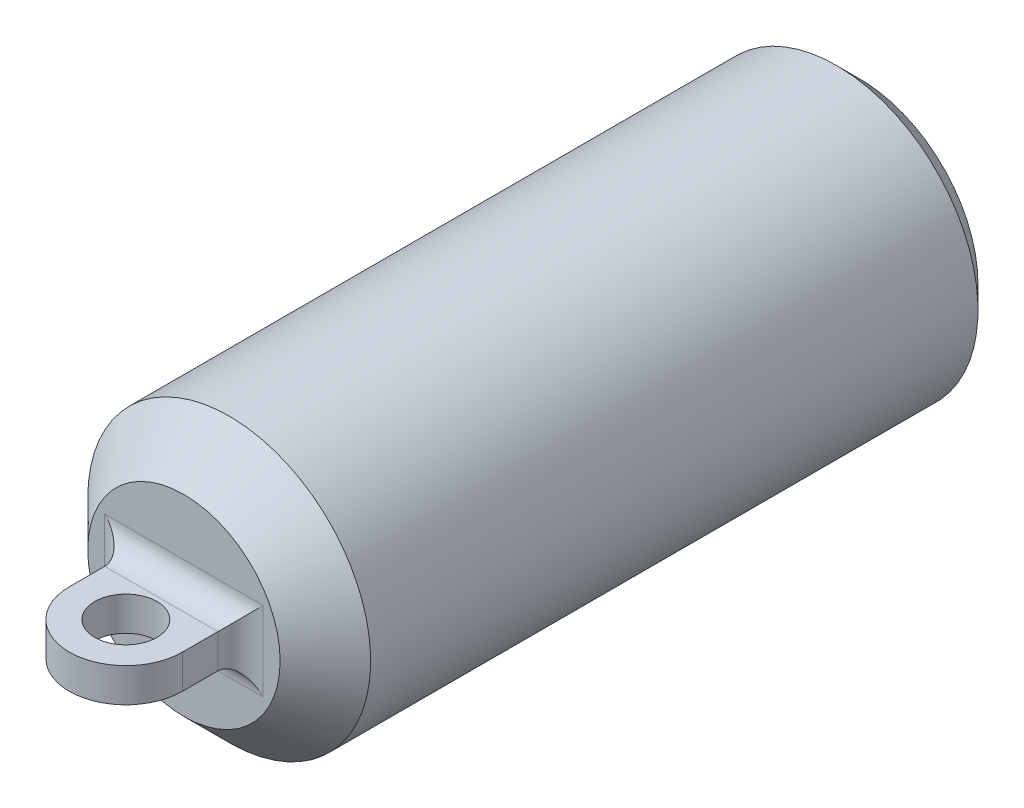
ISO-10303-21;
HEADER;
FILE_DESCRIPTION(('STEP AP214'),'2;1');
FILE_NAME('part.step','',(''),(''),'','','');
FILE_SCHEMA(('AUTOMOTIVE_DESIGN { 1 0 10303 214 1 1 1 1 }'));
ENDSEC;
DATA;
#1=APPLICATION_CONTEXT('core data for automotive mechanical design processes');
#2=APPLICATION_PROTOCOL_DEFINITION('international standard','automotive_design',2000,#1);
#3=PRODUCT_CONTEXT('',#1,'mechanical');
#4=PRODUCT('Part','Part','',(#3));
#5=PRODUCT_RELATED_PRODUCT_CATEGORY('part','',(#4));
#6=PRODUCT_DEFINITION_FORMATION('','',#4);
#7=PRODUCT_DEFINITION_CONTEXT('part definition',#1,'design');
#8=PRODUCT_DEFINITION('design','',#6,#7);
#9=PRODUCT_DEFINITION_SHAPE('','',#8);
#10=(LENGTH_UNIT() NAMED_UNIT(*) SI_UNIT(.MILLI.,.METRE.));
#11=(NAMED_UNIT(*) PLANE_ANGLE_UNIT() SI_UNIT($,.RADIAN.));
#12=(NAMED_UNIT(*) SI_UNIT($,.STERADIAN.) SOLID_ANGLE_UNIT());
#13=UNCERTAINTY_MEASURE_WITH_UNIT(LENGTH_MEASURE(1.E-05),#10,'distance_accuracy_value','');
#14=(GEOMETRIC_REPRESENTATION_CONTEXT(3) GLOBAL_UNCERTAINTY_ASSIGNED_CONTEXT((#13)) GLOBAL_UNIT_ASSIGNED_CONTEXT((#10,
#11,#12)) REPRESENTATION_CONTEXT('',''));
#15=CARTESIAN_POINT('',(0.,0.,0.));
#16=DIRECTION('',(0.,0.,1.));
#17=DIRECTION('',(1.,0.,0.));
#18=AXIS2_PLACEMENT_3D('',#15,#16,#17);
#19=CARTESIAN_POINT('',(0.,12.5,10.5909797822706));
#20=DIRECTION('',(0.,0.,-1.));
#21=DIRECTION('',(-1.,0.,0.));
#22=AXIS2_PLACEMENT_3D('',#19,#20,#21);
#23=PLANE('',#22);
#24=DIRECTION('',(0.,-1.,0.));
#25=VECTOR('',#24,1.);
#26=CARTESIAN_POINT('',(7.,-1.5,10.5909797822706));
#27=LINE('',#26,#25);
#28=CARTESIAN_POINT('',(7.,3.5,10.5909797822706));
#29=VERTEX_POINT('',#28);
#30=CARTESIAN_POINT('',(7.,-3.5,10.5909797822706));
#31=VERTEX_POINT('',#30);
#32=EDGE_CURVE('E148',#29,#31,#27,.T.);
#33=ORIENTED_EDGE('',*,*,#32,.T.);
#34=DIRECTION('',(-1.,0.,0.));
#35=VECTOR('',#34,1.);
#36=CARTESIAN_POINT('',(-5.,-3.5,10.5909797822706));
#37=LINE('',#36,#35);
#38=CARTESIAN_POINT('',(-7.,-3.5,10.5909797822706));
#39=VERTEX_POINT('',#38);
#40=EDGE_CURVE('E155',#31,#39,#37,.T.);
#41=ORIENTED_EDGE('',*,*,#40,.T.);
#42=DIRECTION('',(0.,-1.,0.));
#43=VECTOR('',#42,1.);
#44=CARTESIAN_POINT('',(-7.,1.5,10.5909797822706));
#45=LINE('',#44,#43);
#46=CARTESIAN_POINT('',(-7.,3.5,10.5909797822706));
#47=VERTEX_POINT('',#46);
#48=EDGE_CURVE('E151',#39,#47,#45,.F.);
#49=ORIENTED_EDGE('',*,*,#48,.T.);
#50=DIRECTION('',(-1.,0.,0.));
#51=VECTOR('',#50,1.);
#52=CARTESIAN_POINT('',(0.,3.5,10.5909797822706));
#53=LINE('',#52,#51);
#54=EDGE_CURVE('E145',#47,#29,#53,.F.);
#55=ORIENTED_EDGE('',*,*,#54,.T.);
#56=EDGE_LOOP('',(#33,#41,#49,#55));
#57=FACE_BOUND('',#56,.T.);
#58=CARTESIAN_POINT('',(0.,0.,10.5909797822706));
#59=DIRECTION('',(0.,0.,-1.));
#60=DIRECTION('',(-1.,0.,0.));
#61=AXIS2_PLACEMENT_3D('',#58,#59,#60);
#62=CIRCLE('',#61,8.50000000000001);
#63=CARTESIAN_POINT('',(-8.50000000000001,0.,10.5909797822706));
#64=VERTEX_POINT('',#63);
#65=EDGE_CURVE('E127',#64,#64,#62,.F.);
#66=ORIENTED_EDGE('',*,*,#65,.T.);
#67=EDGE_LOOP('',(#66));
#68=FACE_BOUND('',#67,.T.);
#69=ADVANCED_FACE('F47',(#57,#68),#23,.F.);
#70=CARTESIAN_POINT('',(0.,0.,16.3934745269557));
#71=DIRECTION('',(0.,0.,1.));
#72=DIRECTION('',(1.,0.,0.));
#73=AXIS2_PLACEMENT_3D('',#70,#71,#72);
#74=CYLINDRICAL_SURFACE('',#73,12.5);
#75=CARTESIAN_POINT('',(0.,0.,-47.0823525683783));
#76=DIRECTION('',(0.,0.,-1.));
#77=DIRECTION('',(-1.,0.,0.));
#78=AXIS2_PLACEMENT_3D('',#75,#76,#77);
#79=CIRCLE('',#78,12.5);
#80=CARTESIAN_POINT('',(-12.5,0.,-47.0823525683783));
#81=VERTEX_POINT('',#80);
#82=EDGE_CURVE('E11',#81,#81,#79,.F.);
#83=ORIENTED_EDGE('',*,*,#82,.T.);
#84=EDGE_LOOP('',(#83));
#85=FACE_BOUND('',#84,.T.);
#86=CARTESIAN_POINT('',(0.,0.,6.5909797822706));
#87=DIRECTION('',(0.,0.,-1.));
#88=DIRECTION('',(-1.,0.,0.));
#89=AXIS2_PLACEMENT_3D('',#86,#87,#88);
#90=CIRCLE('',#89,12.5);
#91=CARTESIAN_POINT('',(-12.5,0.,6.5909797822706));
#92=VERTEX_POINT('',#91);
#93=EDGE_CURVE('E133',#92,#92,#90,.T.);
#94=ORIENTED_EDGE('',*,*,#93,.T.);
#95=EDGE_LOOP('',(#94));
#96=FACE_BOUND('',#95,.T.);
#97=ADVANCED_FACE('F197',(#85,#96),#74,.T.);
#98=CARTESIAN_POINT('',(0.,1.5,15.7238098238619));
#99=DIRECTION('',(0.,1.,0.));
#100=DIRECTION('',(0.,0.,1.));
#101=AXIS2_PLACEMENT_3D('',#98,#99,#100);
#102=PLANE('',#101);
#103=DIRECTION('',(0.,0.,-1.));
#104=VECTOR('',#103,1.);
#105=CARTESIAN_POINT('',(5.,1.5,10.5909797822706));
#106=LINE('',#105,#104);
#107=CARTESIAN_POINT('',(5.,1.5,15.7238098238619));
#108=VERTEX_POINT('',#107);
#109=CARTESIAN_POINT('',(5.,1.5,12.5909797822706));
#110=VERTEX_POINT('',#109);
#111=EDGE_CURVE('E101',#108,#110,#106,.T.);
#112=ORIENTED_EDGE('',*,*,#111,.T.);
#113=DIRECTION('',(-1.,0.,0.));
#114=VECTOR('',#113,1.);
#115=CARTESIAN_POINT('',(0.,1.5,12.5909797822706));
#116=LINE('',#115,#114);
#117=CARTESIAN_POINT('',(-5.,1.5,12.5909797822706));
#118=VERTEX_POINT('',#117);
#119=EDGE_CURVE('E162',#110,#118,#116,.T.);
#120=ORIENTED_EDGE('',*,*,#119,.T.);
#121=DIRECTION('',(0.,0.,1.));
#122=VECTOR('',#121,1.);
#123=CARTESIAN_POINT('',(-5.,1.5,15.7238098238619));
#124=LINE('',#123,#122);
#125=CARTESIAN_POINT('',(-5.,1.5,15.7238098238619));
#126=VERTEX_POINT('',#125);
#127=EDGE_CURVE('E110',#118,#126,#124,.T.);
#128=ORIENTED_EDGE('',*,*,#127,.T.);
#129=CARTESIAN_POINT('',(0.,1.5,15.7238098238619));
#130=DIRECTION('',(0.,1.,0.));
#131=DIRECTION('',(0.,0.,1.));
#132=AXIS2_PLACEMENT_3D('',#129,#130,#131);
#133=CIRCLE('',#132,5.);
#134=EDGE_CURVE('E111',#126,#108,#133,.T.);
#135=ORIENTED_EDGE('',*,*,#134,.T.);
#136=EDGE_LOOP('',(#112,#120,#128,#135));
#137=FACE_BOUND('',#136,.T.);
#138=CARTESIAN_POINT('',(0.,1.5,15.7238098238619));
#139=DIRECTION('',(0.,1.,0.));
#140=DIRECTION('',(0.,0.,1.));
#141=AXIS2_PLACEMENT_3D('',#138,#139,#140);
#142=CIRCLE('',#141,2.75);
#143=CARTESIAN_POINT('',(0.,1.5,18.4738098238619));
#144=VERTEX_POINT('',#143);
#145=EDGE_CURVE('E245',#144,#144,#142,.T.);
#146=ORIENTED_EDGE('',*,*,#145,.F.);
#147=EDGE_LOOP('',(#146));
#148=FACE_BOUND('',#147,.T.);
#149=ADVANCED_FACE('F114',(#137,#148),#102,.T.);
#150=CARTESIAN_POINT('',(0.,-1.5,15.7238098238619));
#151=DIRECTION('',(0.,1.,0.));
#152=DIRECTION('',(0.,0.,1.));
#153=AXIS2_PLACEMENT_3D('',#150,#151,#152);
#154=PLANE('',#153);
#155=DIRECTION('',(0.,0.,1.));
#156=VECTOR('',#155,1.);
#157=CARTESIAN_POINT('',(-5.,-1.5,15.7238098238619));
#158=LINE('',#157,#156);
#159=CARTESIAN_POINT('',(-5.,-1.5,12.5909797822706));
#160=VERTEX_POINT('',#159);
#161=CARTESIAN_POINT('',(-5.,-1.5,15.7238098238619));
#162=VERTEX_POINT('',#161);
#163=EDGE_CURVE('E121',#160,#162,#158,.T.);
#164=ORIENTED_EDGE('',*,*,#163,.F.);
#165=DIRECTION('',(-1.,0.,0.));
#166=VECTOR('',#165,1.);
#167=CARTESIAN_POINT('',(5.,-1.5,12.5909797822706));
#168=LINE('',#167,#166);
#169=CARTESIAN_POINT('',(5.,-1.5,12.5909797822706));
#170=VERTEX_POINT('',#169);
#171=EDGE_CURVE('E72',#160,#170,#168,.F.);
#172=ORIENTED_EDGE('',*,*,#171,.T.);
#173=DIRECTION('',(0.,0.,-1.));
#174=VECTOR('',#173,1.);
#175=CARTESIAN_POINT('',(5.,-1.5,10.5909797822706));
#176=LINE('',#175,#174);
#177=CARTESIAN_POINT('',(5.,-1.5,15.7238098238619));
#178=VERTEX_POINT('',#177);
#179=EDGE_CURVE('E244',#178,#170,#176,.T.);
#180=ORIENTED_EDGE('',*,*,#179,.F.);
#181=CARTESIAN_POINT('',(0.,-1.5,15.7238098238619));
#182=DIRECTION('',(0.,1.,0.));
#183=DIRECTION('',(0.,0.,1.));
#184=AXIS2_PLACEMENT_3D('',#181,#182,#183);
#185=CIRCLE('',#184,5.);
#186=EDGE_CURVE('E125',#162,#178,#185,.T.);
#187=ORIENTED_EDGE('',*,*,#186,.F.);
#188=EDGE_LOOP('',(#164,#172,#180,#187));
#189=FACE_BOUND('',#188,.T.);
#190=CARTESIAN_POINT('',(0.,-1.5,15.7238098238619));
#191=DIRECTION('',(0.,1.,0.));
#192=DIRECTION('',(0.,0.,1.));
#193=AXIS2_PLACEMENT_3D('',#190,#191,#192);
#194=CIRCLE('',#193,2.75);
#195=CARTESIAN_POINT('',(0.,-1.5,18.4738098238619));
#196=VERTEX_POINT('',#195);
#197=EDGE_CURVE('E178',#196,#196,#194,.T.);
#198=ORIENTED_EDGE('',*,*,#197,.T.);
#199=EDGE_LOOP('',(#198));
#200=FACE_BOUND('',#199,.T.);
#201=ADVANCED_FACE('F248',(#189,#200),#154,.F.);
#202=CARTESIAN_POINT('',(0.,1.5,15.7238098238619));
#203=DIRECTION('',(0.,-1.,0.));
#204=DIRECTION('',(0.,0.,-1.));
#205=AXIS2_PLACEMENT_3D('',#202,#203,#204);
#206=CYLINDRICAL_SURFACE('',#205,5.);
#207=ORIENTED_EDGE('',*,*,#186,.T.);
#208=DIRECTION('',(0.,-1.,0.));
#209=VECTOR('',#208,1.);
#210=CARTESIAN_POINT('',(5.,1.5,15.7238098238619));
#211=LINE('',#210,#209);
#212=EDGE_CURVE('E105',#108,#178,#211,.T.);
#213=ORIENTED_EDGE('',*,*,#212,.F.);
#214=ORIENTED_EDGE('',*,*,#134,.F.);
#215=DIRECTION('',(0.,-1.,0.));
#216=VECTOR('',#215,1.);
#217=CARTESIAN_POINT('',(-5.,1.5,15.7238098238619));
#218=LINE('',#217,#216);
#219=EDGE_CURVE('E128',#126,#162,#218,.T.);
#220=ORIENTED_EDGE('',*,*,#219,.T.);
#221=EDGE_LOOP('',(#207,#213,#214,#220));
#222=FACE_BOUND('',#221,.T.);
#223=ADVANCED_FACE('F123',(#222),#206,.T.);
#224=CARTESIAN_POINT('',(5.,1.5,10.5909797822706));
#225=DIRECTION('',(-1.,0.,0.));
#226=DIRECTION('',(0.,0.,1.));
#227=AXIS2_PLACEMENT_3D('',#224,#225,#226);
#228=PLANE('',#227);
#229=ORIENTED_EDGE('',*,*,#179,.T.);
#230=DIRECTION('',(0.,-1.,0.));
#231=VECTOR('',#230,1.);
#232=CARTESIAN_POINT('',(5.,1.5,12.5909797822706));
#233=LINE('',#232,#231);
#234=EDGE_CURVE('E64',#170,#110,#233,.F.);
#235=ORIENTED_EDGE('',*,*,#234,.T.);
#236=ORIENTED_EDGE('',*,*,#111,.F.);
#237=ORIENTED_EDGE('',*,*,#212,.T.);
#238=EDGE_LOOP('',(#229,#235,#236,#237));
#239=FACE_BOUND('',#238,.T.);
#240=ADVANCED_FACE('F103',(#239),#228,.F.);
#241=CARTESIAN_POINT('',(-5.,1.5,15.7238098238619));
#242=DIRECTION('',(1.,0.,0.));
#243=DIRECTION('',(0.,0.,-1.));
#244=AXIS2_PLACEMENT_3D('',#241,#242,#243);
#245=PLANE('',#244);
#246=ORIENTED_EDGE('',*,*,#127,.F.);
#247=DIRECTION('',(0.,-1.,0.));
#248=VECTOR('',#247,1.);
#249=CARTESIAN_POINT('',(-5.,-1.5,12.5909797822706));
#250=LINE('',#249,#248);
#251=EDGE_CURVE('E141',#118,#160,#250,.T.);
#252=ORIENTED_EDGE('',*,*,#251,.T.);
#253=ORIENTED_EDGE('',*,*,#163,.T.);
#254=ORIENTED_EDGE('',*,*,#219,.F.);
#255=EDGE_LOOP('',(#246,#252,#253,#254));
#256=FACE_BOUND('',#255,.T.);
#257=ADVANCED_FACE('F238',(#256),#245,.F.);
#258=CARTESIAN_POINT('',(0.,1.5,15.7238098238619));
#259=DIRECTION('',(0.,-1.,0.));
#260=DIRECTION('',(0.,0.,-1.));
#261=AXIS2_PLACEMENT_3D('',#258,#259,#260);
#262=CYLINDRICAL_SURFACE('',#261,2.75);
#263=ORIENTED_EDGE('',*,*,#145,.T.);
#264=EDGE_LOOP('',(#263));
#265=FACE_BOUND('',#264,.T.);
#266=ORIENTED_EDGE('',*,*,#197,.F.);
#267=EDGE_LOOP('',(#266));
#268=FACE_BOUND('',#267,.T.);
#269=ADVANCED_FACE('F262',(#265,#268),#262,.F.);
#270=CARTESIAN_POINT('',(0.,0.,-49.0823525683783));
#271=DIRECTION('',(0.,0.,-1.));
#272=DIRECTION('',(-1.,0.,0.));
#273=AXIS2_PLACEMENT_3D('',#270,#271,#272);
#274=PLANE('',#273);
#275=CARTESIAN_POINT('',(0.,0.,-49.0823525683783));
#276=DIRECTION('',(0.,0.,-1.));
#277=DIRECTION('',(-1.,0.,0.));
#278=AXIS2_PLACEMENT_3D('',#275,#276,#277);
#279=CIRCLE('',#278,10.5);
#280=CARTESIAN_POINT('',(-10.5,0.,-49.0823525683783));
#281=VERTEX_POINT('',#280);
#282=EDGE_CURVE('E57',#281,#281,#279,.T.);
#283=ORIENTED_EDGE('',*,*,#282,.T.);
#284=EDGE_LOOP('',(#283));
#285=FACE_BOUND('',#284,.T.);
#286=ADVANCED_FACE('F183',(#285),#274,.T.);
#287=CARTESIAN_POINT('',(0.,0.,10.5909797822706));
#288=DIRECTION('',(0.,0.,-1.));
#289=DIRECTION('',(-1.,0.,0.));
#290=AXIS2_PLACEMENT_3D('',#287,#288,#289);
#291=CONICAL_SURFACE('',#290,8.50000000000001,0.785398163397446);
#292=ORIENTED_EDGE('',*,*,#93,.F.);
#293=EDGE_LOOP('',(#292));
#294=FACE_BOUND('',#293,.T.);
#295=ORIENTED_EDGE('',*,*,#65,.F.);
#296=EDGE_LOOP('',(#295));
#297=FACE_BOUND('',#296,.T.);
#298=ADVANCED_FACE('F211',(#294,#297),#291,.T.);
#299=CARTESIAN_POINT('',(7.,12.5,12.5909797822706));
#300=DIRECTION('',(0.,1.,0.));
#301=DIRECTION('',(0.,0.,1.));
#302=AXIS2_PLACEMENT_3D('',#299,#300,#301);
#303=CYLINDRICAL_SURFACE('',#302,2.);
#304=CARTESIAN_POINT('',(7.,-3.5,12.5909797822706));
#305=DIRECTION('',(0.707106781186547,0.707106781186547,0.));
#306=DIRECTION('',(0.707106781186547,-0.707106781186547,0.));
#307=AXIS2_PLACEMENT_3D('',#304,#305,#306);
#308=ELLIPSE('',#307,2.82842712474619,2.);
#309=EDGE_CURVE('E171',#31,#170,#308,.T.);
#310=ORIENTED_EDGE('',*,*,#309,.F.);
#311=ORIENTED_EDGE('',*,*,#32,.F.);
#312=CARTESIAN_POINT('',(7.,3.5,12.5909797822706));
#313=DIRECTION('',(-0.707106781186547,0.707106781186547,0.));
#314=DIRECTION('',(-0.707106781186547,-0.707106781186547,0.));
#315=AXIS2_PLACEMENT_3D('',#312,#313,#314);
#316=ELLIPSE('',#315,2.82842712474619,2.);
#317=EDGE_CURVE('E175',#110,#29,#316,.F.);
#318=ORIENTED_EDGE('',*,*,#317,.F.);
#319=ORIENTED_EDGE('',*,*,#234,.F.);
#320=EDGE_LOOP('',(#310,#311,#318,#319));
#321=FACE_BOUND('',#320,.T.);
#322=ADVANCED_FACE('F214',(#321),#303,.F.);
#323=CARTESIAN_POINT('',(0.,3.5,12.5909797822706));
#324=DIRECTION('',(-1.,0.,0.));
#325=DIRECTION('',(0.,0.,1.));
#326=AXIS2_PLACEMENT_3D('',#323,#324,#325);
#327=CYLINDRICAL_SURFACE('',#326,2.);
#328=ORIENTED_EDGE('',*,*,#317,.T.);
#329=ORIENTED_EDGE('',*,*,#54,.F.);
#330=CARTESIAN_POINT('',(-7.,3.5,12.5909797822706));
#331=DIRECTION('',(-0.707106781186547,-0.707106781186547,0.));
#332=DIRECTION('',(-0.707106781186547,0.707106781186547,0.));
#333=AXIS2_PLACEMENT_3D('',#330,#331,#332);
#334=ELLIPSE('',#333,2.82842712474619,2.);
#335=EDGE_CURVE('E168',#118,#47,#334,.F.);
#336=ORIENTED_EDGE('',*,*,#335,.F.);
#337=ORIENTED_EDGE('',*,*,#119,.F.);
#338=EDGE_LOOP('',(#328,#329,#336,#337));
#339=FACE_BOUND('',#338,.T.);
#340=ADVANCED_FACE('F219',(#339),#327,.F.);
#341=CARTESIAN_POINT('',(0.,-3.5,12.5909797822706));
#342=DIRECTION('',(1.,0.,0.));
#343=DIRECTION('',(0.,0.,-1.));
#344=AXIS2_PLACEMENT_3D('',#341,#342,#343);
#345=CYLINDRICAL_SURFACE('',#344,2.);
#346=ORIENTED_EDGE('',*,*,#309,.T.);
#347=ORIENTED_EDGE('',*,*,#171,.F.);
#348=CARTESIAN_POINT('',(-7.,-3.5,12.5909797822706));
#349=DIRECTION('',(0.707106781186547,-0.707106781186547,0.));
#350=DIRECTION('',(0.707106781186547,0.707106781186547,0.));
#351=AXIS2_PLACEMENT_3D('',#348,#349,#350);
#352=ELLIPSE('',#351,2.82842712474619,2.);
#353=EDGE_CURVE('E165',#39,#160,#352,.T.);
#354=ORIENTED_EDGE('',*,*,#353,.F.);
#355=ORIENTED_EDGE('',*,*,#40,.F.);
#356=EDGE_LOOP('',(#346,#347,#354,#355));
#357=FACE_BOUND('',#356,.T.);
#358=ADVANCED_FACE('F192',(#357),#345,.F.);
#359=CARTESIAN_POINT('',(-7.,1.5,12.5909797822706));
#360=DIRECTION('',(0.,1.,0.));
#361=DIRECTION('',(0.,0.,1.));
#362=AXIS2_PLACEMENT_3D('',#359,#360,#361);
#363=CYLINDRICAL_SURFACE('',#362,2.);
#364=ORIENTED_EDGE('',*,*,#335,.T.);
#365=ORIENTED_EDGE('',*,*,#48,.F.);
#366=ORIENTED_EDGE('',*,*,#353,.T.);
#367=ORIENTED_EDGE('',*,*,#251,.F.);
#368=EDGE_LOOP('',(#364,#365,#366,#367));
#369=FACE_BOUND('',#368,.T.);
#370=ADVANCED_FACE('F186',(#369),#363,.F.);
#371=CARTESIAN_POINT('',(0.,0.,-49.0823525683783));
#372=DIRECTION('',(0.,0.,1.));
#373=DIRECTION('',(1.,0.,0.));
#374=AXIS2_PLACEMENT_3D('',#371,#372,#373);
#375=CONICAL_SURFACE('',#374,10.5,0.785398163397446);
#376=ORIENTED_EDGE('',*,*,#82,.F.);
#377=EDGE_LOOP('',(#376));
#378=FACE_BOUND('',#377,.T.);
#379=ORIENTED_EDGE('',*,*,#282,.F.);
#380=EDGE_LOOP('',(#379));
#381=FACE_BOUND('',#380,.T.);
#382=ADVANCED_FACE('F50',(#378,#381),#375,.T.);
#383=CLOSED_SHELL('',(#69,#97,#149,#201,#223,#240,#257,#269,#286,#298,#322,#340,#358,#370,#382));
#384=MANIFOLD_SOLID_BREP('B2',#383);
#385=ADVANCED_BREP_SHAPE_REPRESENTATION('',(#18,#384),#14);
#386=SHAPE_DEFINITION_REPRESENTATION(#9,#385);
ENDSEC;
END-ISO-10303-21;
